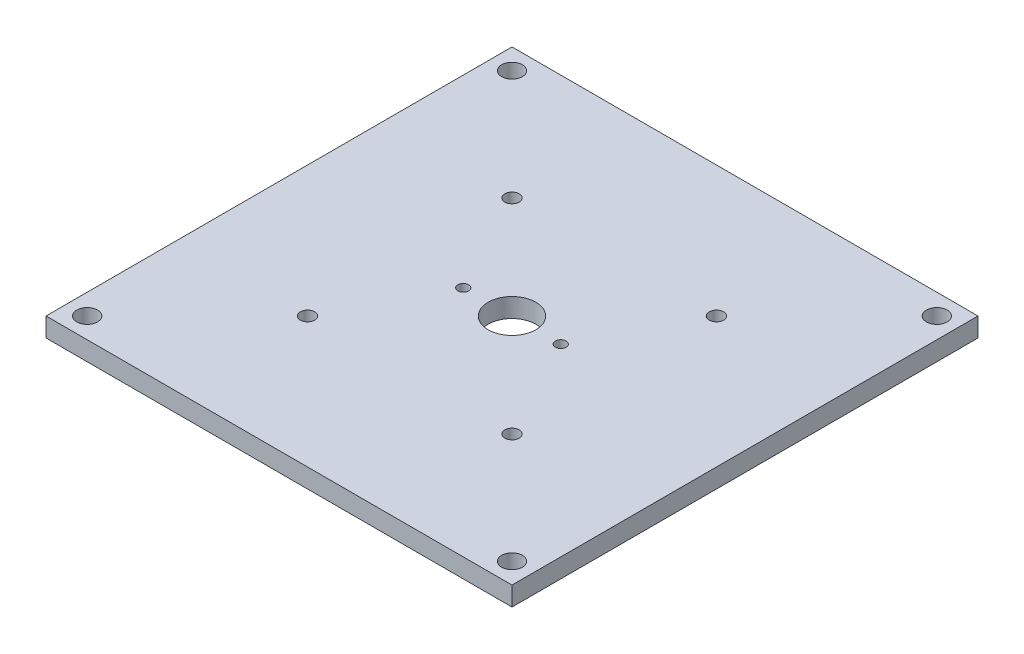
ISO-10303-21;
HEADER;
FILE_DESCRIPTION(('STEP AP214'),'2;1');
FILE_NAME('part.step','',(''),(''),'','','');
FILE_SCHEMA(('AUTOMOTIVE_DESIGN { 1 0 10303 214 1 1 1 1 }'));
ENDSEC;
DATA;
#1=APPLICATION_CONTEXT('core data for automotive mechanical design processes');
#2=APPLICATION_PROTOCOL_DEFINITION('international standard','automotive_design',2000,#1);
#3=PRODUCT_CONTEXT('',#1,'mechanical');
#4=PRODUCT('Part','Part','',(#3));
#5=PRODUCT_RELATED_PRODUCT_CATEGORY('part','',(#4));
#6=PRODUCT_DEFINITION_FORMATION('','',#4);
#7=PRODUCT_DEFINITION_CONTEXT('part definition',#1,'design');
#8=PRODUCT_DEFINITION('design','',#6,#7);
#9=PRODUCT_DEFINITION_SHAPE('','',#8);
#10=(LENGTH_UNIT() NAMED_UNIT(*) SI_UNIT(.MILLI.,.METRE.));
#11=(NAMED_UNIT(*) PLANE_ANGLE_UNIT() SI_UNIT($,.RADIAN.));
#12=(NAMED_UNIT(*) SI_UNIT($,.STERADIAN.) SOLID_ANGLE_UNIT());
#13=UNCERTAINTY_MEASURE_WITH_UNIT(LENGTH_MEASURE(1.E-05),#10,'distance_accuracy_value','');
#14=(GEOMETRIC_REPRESENTATION_CONTEXT(3) GLOBAL_UNCERTAINTY_ASSIGNED_CONTEXT((#13)) GLOBAL_UNIT_ASSIGNED_CONTEXT((#10,
#11,#12)) REPRESENTATION_CONTEXT('',''));
#15=CARTESIAN_POINT('',(0.,0.,0.));
#16=DIRECTION('',(0.,0.,1.));
#17=DIRECTION('',(1.,0.,0.));
#18=AXIS2_PLACEMENT_3D('',#15,#16,#17);
#19=CARTESIAN_POINT('',(-77.5,6.35,-77.5));
#20=DIRECTION('',(1.,0.,0.));
#21=DIRECTION('',(0.,0.,-1.));
#22=AXIS2_PLACEMENT_3D('',#19,#20,#21);
#23=PLANE('',#22);
#24=DIRECTION('',(0.,0.,1.));
#25=VECTOR('',#24,1.);
#26=CARTESIAN_POINT('',(-77.5,0.,-77.5));
#27=LINE('',#26,#25);
#28=CARTESIAN_POINT('',(-77.5,0.,-77.5));
#29=VERTEX_POINT('',#28);
#30=CARTESIAN_POINT('',(-77.5,0.,77.5));
#31=VERTEX_POINT('',#30);
#32=EDGE_CURVE('E97',#29,#31,#27,.T.);
#33=ORIENTED_EDGE('',*,*,#32,.T.);
#34=DIRECTION('',(0.,-1.,0.));
#35=VECTOR('',#34,1.);
#36=CARTESIAN_POINT('',(-77.5,6.35,77.5));
#37=LINE('',#36,#35);
#38=CARTESIAN_POINT('',(-77.5,6.35,77.5));
#39=VERTEX_POINT('',#38);
#40=EDGE_CURVE('E11',#39,#31,#37,.T.);
#41=ORIENTED_EDGE('',*,*,#40,.F.);
#42=DIRECTION('',(0.,0.,1.));
#43=VECTOR('',#42,1.);
#44=CARTESIAN_POINT('',(-77.5,6.35,-77.5));
#45=LINE('',#44,#43);
#46=CARTESIAN_POINT('',(-77.5,6.35,-77.5));
#47=VERTEX_POINT('',#46);
#48=EDGE_CURVE('E85',#47,#39,#45,.T.);
#49=ORIENTED_EDGE('',*,*,#48,.F.);
#50=DIRECTION('',(0.,-1.,0.));
#51=VECTOR('',#50,1.);
#52=CARTESIAN_POINT('',(-77.5,6.35,-77.5));
#53=LINE('',#52,#51);
#54=EDGE_CURVE('E93',#47,#29,#53,.T.);
#55=ORIENTED_EDGE('',*,*,#54,.T.);
#56=EDGE_LOOP('',(#33,#41,#49,#55));
#57=FACE_BOUND('',#56,.T.);
#58=ADVANCED_FACE('F34',(#57),#23,.F.);
#59=CARTESIAN_POINT('',(-77.5,6.35,77.5));
#60=DIRECTION('',(0.,0.,-1.));
#61=DIRECTION('',(-1.,0.,0.));
#62=AXIS2_PLACEMENT_3D('',#59,#60,#61);
#63=PLANE('',#62);
#64=DIRECTION('',(1.,0.,0.));
#65=VECTOR('',#64,1.);
#66=CARTESIAN_POINT('',(-77.5,0.,77.5));
#67=LINE('',#66,#65);
#68=CARTESIAN_POINT('',(77.5,0.,77.5));
#69=VERTEX_POINT('',#68);
#70=EDGE_CURVE('E89',#31,#69,#67,.T.);
#71=ORIENTED_EDGE('',*,*,#70,.T.);
#72=DIRECTION('',(0.,-1.,0.));
#73=VECTOR('',#72,1.);
#74=CARTESIAN_POINT('',(77.5,6.35,77.5));
#75=LINE('',#74,#73);
#76=CARTESIAN_POINT('',(77.5,6.35,77.5));
#77=VERTEX_POINT('',#76);
#78=EDGE_CURVE('E42',#77,#69,#75,.T.);
#79=ORIENTED_EDGE('',*,*,#78,.F.);
#80=DIRECTION('',(1.,0.,0.));
#81=VECTOR('',#80,1.);
#82=CARTESIAN_POINT('',(-77.5,6.35,77.5));
#83=LINE('',#82,#81);
#84=EDGE_CURVE('E80',#39,#77,#83,.T.);
#85=ORIENTED_EDGE('',*,*,#84,.F.);
#86=ORIENTED_EDGE('',*,*,#40,.T.);
#87=EDGE_LOOP('',(#71,#79,#85,#86));
#88=FACE_BOUND('',#87,.T.);
#89=ADVANCED_FACE('F88',(#88),#63,.F.);
#90=CARTESIAN_POINT('',(77.5,6.35,-77.5));
#91=DIRECTION('',(-1.,0.,0.));
#92=DIRECTION('',(0.,0.,1.));
#93=AXIS2_PLACEMENT_3D('',#90,#91,#92);
#94=PLANE('',#93);
#95=DIRECTION('',(0.,0.,-1.));
#96=VECTOR('',#95,1.);
#97=CARTESIAN_POINT('',(77.5,0.,-77.5));
#98=LINE('',#97,#96);
#99=CARTESIAN_POINT('',(77.5,0.,-77.5));
#100=VERTEX_POINT('',#99);
#101=EDGE_CURVE('E67',#69,#100,#98,.T.);
#102=ORIENTED_EDGE('',*,*,#101,.T.);
#103=DIRECTION('',(0.,-1.,0.));
#104=VECTOR('',#103,1.);
#105=CARTESIAN_POINT('',(77.5,6.35,-77.5));
#106=LINE('',#105,#104);
#107=CARTESIAN_POINT('',(77.5,6.35,-77.5));
#108=VERTEX_POINT('',#107);
#109=EDGE_CURVE('E90',#108,#100,#106,.T.);
#110=ORIENTED_EDGE('',*,*,#109,.F.);
#111=DIRECTION('',(0.,0.,-1.));
#112=VECTOR('',#111,1.);
#113=CARTESIAN_POINT('',(77.5,6.35,-77.5));
#114=LINE('',#113,#112);
#115=EDGE_CURVE('E83',#77,#108,#114,.T.);
#116=ORIENTED_EDGE('',*,*,#115,.F.);
#117=ORIENTED_EDGE('',*,*,#78,.T.);
#118=EDGE_LOOP('',(#102,#110,#116,#117));
#119=FACE_BOUND('',#118,.T.);
#120=ADVANCED_FACE('F91',(#119),#94,.F.);
#121=CARTESIAN_POINT('',(-77.5,6.35,-77.5));
#122=DIRECTION('',(0.,0.,1.));
#123=DIRECTION('',(1.,0.,0.));
#124=AXIS2_PLACEMENT_3D('',#121,#122,#123);
#125=PLANE('',#124);
#126=DIRECTION('',(-1.,0.,0.));
#127=VECTOR('',#126,1.);
#128=CARTESIAN_POINT('',(-77.5,0.,-77.5));
#129=LINE('',#128,#127);
#130=EDGE_CURVE('E73',#100,#29,#129,.T.);
#131=ORIENTED_EDGE('',*,*,#130,.T.);
#132=ORIENTED_EDGE('',*,*,#54,.F.);
#133=DIRECTION('',(-1.,0.,0.));
#134=VECTOR('',#133,1.);
#135=CARTESIAN_POINT('',(-77.5,6.35,-77.5));
#136=LINE('',#135,#134);
#137=EDGE_CURVE('E50',#108,#47,#136,.T.);
#138=ORIENTED_EDGE('',*,*,#137,.F.);
#139=ORIENTED_EDGE('',*,*,#109,.T.);
#140=EDGE_LOOP('',(#131,#132,#138,#139));
#141=FACE_BOUND('',#140,.T.);
#142=ADVANCED_FACE('F105',(#141),#125,.F.);
#143=CARTESIAN_POINT('',(0.,6.35,0.));
#144=DIRECTION('',(0.,1.,0.));
#145=DIRECTION('',(0.,0.,1.));
#146=AXIS2_PLACEMENT_3D('',#143,#144,#145);
#147=PLANE('',#146);
#148=CARTESIAN_POINT('',(16.215,6.35,0.));
#149=DIRECTION('',(0.,1.,0.));
#150=DIRECTION('',(0.,0.,1.));
#151=AXIS2_PLACEMENT_3D('',#148,#149,#150);
#152=CIRCLE('',#151,1.8);
#153=CARTESIAN_POINT('',(16.215,6.35,1.79999999999999));
#154=VERTEX_POINT('',#153);
#155=EDGE_CURVE('E173',#154,#154,#152,.T.);
#156=ORIENTED_EDGE('',*,*,#155,.F.);
#157=EDGE_LOOP('',(#156));
#158=FACE_BOUND('',#157,.T.);
#159=CARTESIAN_POINT('',(-16.215,6.35,0.));
#160=DIRECTION('',(0.,1.,0.));
#161=DIRECTION('',(0.,0.,1.));
#162=AXIS2_PLACEMENT_3D('',#159,#160,#161);
#163=CIRCLE('',#162,1.8);
#164=CARTESIAN_POINT('',(-16.215,6.35,1.8));
#165=VERTEX_POINT('',#164);
#166=EDGE_CURVE('E167',#165,#165,#163,.T.);
#167=ORIENTED_EDGE('',*,*,#166,.F.);
#168=EDGE_LOOP('',(#167));
#169=FACE_BOUND('',#168,.T.);
#170=CARTESIAN_POINT('',(-34.,6.35,-34.));
#171=DIRECTION('',(0.,1.,0.));
#172=DIRECTION('',(0.,0.,1.));
#173=AXIS2_PLACEMENT_3D('',#170,#171,#172);
#174=CIRCLE('',#173,2.4);
#175=CARTESIAN_POINT('',(-34.,6.35,-31.6));
#176=VERTEX_POINT('',#175);
#177=EDGE_CURVE('E161',#176,#176,#174,.T.);
#178=ORIENTED_EDGE('',*,*,#177,.F.);
#179=EDGE_LOOP('',(#178));
#180=FACE_BOUND('',#179,.T.);
#181=CARTESIAN_POINT('',(34.,6.35,-34.));
#182=DIRECTION('',(0.,1.,0.));
#183=DIRECTION('',(0.,0.,1.));
#184=AXIS2_PLACEMENT_3D('',#181,#182,#183);
#185=CIRCLE('',#184,2.4);
#186=CARTESIAN_POINT('',(34.,6.35,-31.6));
#187=VERTEX_POINT('',#186);
#188=EDGE_CURVE('E155',#187,#187,#185,.T.);
#189=ORIENTED_EDGE('',*,*,#188,.F.);
#190=EDGE_LOOP('',(#189));
#191=FACE_BOUND('',#190,.T.);
#192=CARTESIAN_POINT('',(34.,6.35,34.));
#193=DIRECTION('',(0.,1.,0.));
#194=DIRECTION('',(0.,0.,1.));
#195=AXIS2_PLACEMENT_3D('',#192,#193,#194);
#196=CIRCLE('',#195,2.4);
#197=CARTESIAN_POINT('',(34.,6.35,36.4));
#198=VERTEX_POINT('',#197);
#199=EDGE_CURVE('E149',#198,#198,#196,.T.);
#200=ORIENTED_EDGE('',*,*,#199,.F.);
#201=EDGE_LOOP('',(#200));
#202=FACE_BOUND('',#201,.T.);
#203=CARTESIAN_POINT('',(-34.,6.35,34.));
#204=DIRECTION('',(0.,1.,0.));
#205=DIRECTION('',(0.,0.,1.));
#206=AXIS2_PLACEMENT_3D('',#203,#204,#205);
#207=CIRCLE('',#206,2.4);
#208=CARTESIAN_POINT('',(-34.,6.35,36.4));
#209=VERTEX_POINT('',#208);
#210=EDGE_CURVE('E143',#209,#209,#207,.T.);
#211=ORIENTED_EDGE('',*,*,#210,.F.);
#212=EDGE_LOOP('',(#211));
#213=FACE_BOUND('',#212,.T.);
#214=CARTESIAN_POINT('',(0.,6.35,0.));
#215=DIRECTION('',(0.,1.,0.));
#216=DIRECTION('',(0.,0.,1.));
#217=AXIS2_PLACEMENT_3D('',#214,#215,#216);
#218=CIRCLE('',#217,7.9375);
#219=CARTESIAN_POINT('',(0.,6.35,7.9375));
#220=VERTEX_POINT('',#219);
#221=EDGE_CURVE('E137',#220,#220,#218,.T.);
#222=ORIENTED_EDGE('',*,*,#221,.F.);
#223=EDGE_LOOP('',(#222));
#224=FACE_BOUND('',#223,.T.);
#225=CARTESIAN_POINT('',(-70.65,6.35,-70.65));
#226=DIRECTION('',(0.,1.,0.));
#227=DIRECTION('',(0.,0.,1.));
#228=AXIS2_PLACEMENT_3D('',#225,#226,#227);
#229=CIRCLE('',#228,3.4417);
#230=CARTESIAN_POINT('',(-70.65,6.35,-67.2083));
#231=VERTEX_POINT('',#230);
#232=EDGE_CURVE('E120',#231,#231,#229,.T.);
#233=ORIENTED_EDGE('',*,*,#232,.F.);
#234=EDGE_LOOP('',(#233));
#235=FACE_BOUND('',#234,.T.);
#236=CARTESIAN_POINT('',(70.65,6.35,70.65));
#237=DIRECTION('',(0.,1.,0.));
#238=DIRECTION('',(0.,0.,1.));
#239=AXIS2_PLACEMENT_3D('',#236,#237,#238);
#240=CIRCLE('',#239,3.4417);
#241=CARTESIAN_POINT('',(70.65,6.35,74.0917));
#242=VERTEX_POINT('',#241);
#243=EDGE_CURVE('E121',#242,#242,#240,.T.);
#244=ORIENTED_EDGE('',*,*,#243,.F.);
#245=EDGE_LOOP('',(#244));
#246=FACE_BOUND('',#245,.T.);
#247=CARTESIAN_POINT('',(-70.65,6.35,70.65));
#248=DIRECTION('',(0.,1.,0.));
#249=DIRECTION('',(0.,0.,1.));
#250=AXIS2_PLACEMENT_3D('',#247,#248,#249);
#251=CIRCLE('',#250,3.4417);
#252=CARTESIAN_POINT('',(-70.65,6.35,74.0917));
#253=VERTEX_POINT('',#252);
#254=EDGE_CURVE('E131',#253,#253,#251,.T.);
#255=ORIENTED_EDGE('',*,*,#254,.F.);
#256=EDGE_LOOP('',(#255));
#257=FACE_BOUND('',#256,.T.);
#258=CARTESIAN_POINT('',(70.65,6.35,-70.65));
#259=DIRECTION('',(0.,1.,0.));
#260=DIRECTION('',(0.,0.,1.));
#261=AXIS2_PLACEMENT_3D('',#258,#259,#260);
#262=CIRCLE('',#261,3.4417);
#263=CARTESIAN_POINT('',(70.65,6.35,-67.2083));
#264=VERTEX_POINT('',#263);
#265=EDGE_CURVE('E113',#264,#264,#262,.T.);
#266=ORIENTED_EDGE('',*,*,#265,.F.);
#267=EDGE_LOOP('',(#266));
#268=FACE_BOUND('',#267,.T.);
#269=ORIENTED_EDGE('',*,*,#48,.T.);
#270=ORIENTED_EDGE('',*,*,#84,.T.);
#271=ORIENTED_EDGE('',*,*,#115,.T.);
#272=ORIENTED_EDGE('',*,*,#137,.T.);
#273=EDGE_LOOP('',(#269,#270,#271,#272));
#274=FACE_BOUND('',#273,.T.);
#275=ADVANCED_FACE('F81',(#158,#169,#180,#191,#202,#213,#224,#235,#246,#257,#268,#274),#147,.T.);
#276=CARTESIAN_POINT('',(0.,0.,0.));
#277=DIRECTION('',(0.,1.,0.));
#278=DIRECTION('',(0.,0.,1.));
#279=AXIS2_PLACEMENT_3D('',#276,#277,#278);
#280=PLANE('',#279);
#281=CARTESIAN_POINT('',(16.215,0.,0.));
#282=DIRECTION('',(0.,1.,0.));
#283=DIRECTION('',(0.,0.,1.));
#284=AXIS2_PLACEMENT_3D('',#281,#282,#283);
#285=CIRCLE('',#284,1.8);
#286=CARTESIAN_POINT('',(16.215,0.,1.79999999999999));
#287=VERTEX_POINT('',#286);
#288=EDGE_CURVE('E170',#287,#287,#285,.T.);
#289=ORIENTED_EDGE('',*,*,#288,.T.);
#290=EDGE_LOOP('',(#289));
#291=FACE_BOUND('',#290,.T.);
#292=CARTESIAN_POINT('',(-16.215,0.,0.));
#293=DIRECTION('',(0.,1.,0.));
#294=DIRECTION('',(0.,0.,1.));
#295=AXIS2_PLACEMENT_3D('',#292,#293,#294);
#296=CIRCLE('',#295,1.8);
#297=CARTESIAN_POINT('',(-16.215,0.,1.8));
#298=VERTEX_POINT('',#297);
#299=EDGE_CURVE('E164',#298,#298,#296,.T.);
#300=ORIENTED_EDGE('',*,*,#299,.T.);
#301=EDGE_LOOP('',(#300));
#302=FACE_BOUND('',#301,.T.);
#303=CARTESIAN_POINT('',(-34.,0.,-34.));
#304=DIRECTION('',(0.,1.,0.));
#305=DIRECTION('',(0.,0.,1.));
#306=AXIS2_PLACEMENT_3D('',#303,#304,#305);
#307=CIRCLE('',#306,2.4);
#308=CARTESIAN_POINT('',(-34.,0.,-31.6));
#309=VERTEX_POINT('',#308);
#310=EDGE_CURVE('E158',#309,#309,#307,.T.);
#311=ORIENTED_EDGE('',*,*,#310,.T.);
#312=EDGE_LOOP('',(#311));
#313=FACE_BOUND('',#312,.T.);
#314=CARTESIAN_POINT('',(34.,0.,-34.));
#315=DIRECTION('',(0.,1.,0.));
#316=DIRECTION('',(0.,0.,1.));
#317=AXIS2_PLACEMENT_3D('',#314,#315,#316);
#318=CIRCLE('',#317,2.4);
#319=CARTESIAN_POINT('',(34.,0.,-31.6));
#320=VERTEX_POINT('',#319);
#321=EDGE_CURVE('E152',#320,#320,#318,.T.);
#322=ORIENTED_EDGE('',*,*,#321,.T.);
#323=EDGE_LOOP('',(#322));
#324=FACE_BOUND('',#323,.T.);
#325=CARTESIAN_POINT('',(34.,0.,34.));
#326=DIRECTION('',(0.,1.,0.));
#327=DIRECTION('',(0.,0.,1.));
#328=AXIS2_PLACEMENT_3D('',#325,#326,#327);
#329=CIRCLE('',#328,2.4);
#330=CARTESIAN_POINT('',(34.,0.,36.4));
#331=VERTEX_POINT('',#330);
#332=EDGE_CURVE('E146',#331,#331,#329,.T.);
#333=ORIENTED_EDGE('',*,*,#332,.T.);
#334=EDGE_LOOP('',(#333));
#335=FACE_BOUND('',#334,.T.);
#336=CARTESIAN_POINT('',(-34.,0.,34.));
#337=DIRECTION('',(0.,1.,0.));
#338=DIRECTION('',(0.,0.,1.));
#339=AXIS2_PLACEMENT_3D('',#336,#337,#338);
#340=CIRCLE('',#339,2.4);
#341=CARTESIAN_POINT('',(-34.,0.,36.4));
#342=VERTEX_POINT('',#341);
#343=EDGE_CURVE('E140',#342,#342,#340,.T.);
#344=ORIENTED_EDGE('',*,*,#343,.T.);
#345=EDGE_LOOP('',(#344));
#346=FACE_BOUND('',#345,.T.);
#347=CARTESIAN_POINT('',(0.,0.,0.));
#348=DIRECTION('',(0.,1.,0.));
#349=DIRECTION('',(0.,0.,1.));
#350=AXIS2_PLACEMENT_3D('',#347,#348,#349);
#351=CIRCLE('',#350,7.9375);
#352=CARTESIAN_POINT('',(0.,0.,7.9375));
#353=VERTEX_POINT('',#352);
#354=EDGE_CURVE('E134',#353,#353,#351,.F.);
#355=ORIENTED_EDGE('',*,*,#354,.F.);
#356=EDGE_LOOP('',(#355));
#357=FACE_BOUND('',#356,.T.);
#358=CARTESIAN_POINT('',(-70.65,0.,-70.65));
#359=DIRECTION('',(0.,1.,0.));
#360=DIRECTION('',(0.,0.,1.));
#361=AXIS2_PLACEMENT_3D('',#358,#359,#360);
#362=CIRCLE('',#361,3.4417);
#363=CARTESIAN_POINT('',(-70.65,0.,-67.2083));
#364=VERTEX_POINT('',#363);
#365=EDGE_CURVE('E116',#364,#364,#362,.F.);
#366=ORIENTED_EDGE('',*,*,#365,.F.);
#367=EDGE_LOOP('',(#366));
#368=FACE_BOUND('',#367,.T.);
#369=CARTESIAN_POINT('',(70.65,0.,70.65));
#370=DIRECTION('',(0.,1.,0.));
#371=DIRECTION('',(0.,0.,1.));
#372=AXIS2_PLACEMENT_3D('',#369,#370,#371);
#373=CIRCLE('',#372,3.4417);
#374=CARTESIAN_POINT('',(70.65,0.,74.0917));
#375=VERTEX_POINT('',#374);
#376=EDGE_CURVE('E117',#375,#375,#373,.F.);
#377=ORIENTED_EDGE('',*,*,#376,.F.);
#378=EDGE_LOOP('',(#377));
#379=FACE_BOUND('',#378,.T.);
#380=CARTESIAN_POINT('',(-70.65,0.,70.65));
#381=DIRECTION('',(0.,1.,0.));
#382=DIRECTION('',(0.,0.,1.));
#383=AXIS2_PLACEMENT_3D('',#380,#381,#382);
#384=CIRCLE('',#383,3.4417);
#385=CARTESIAN_POINT('',(-70.65,0.,74.0917));
#386=VERTEX_POINT('',#385);
#387=EDGE_CURVE('E124',#386,#386,#384,.F.);
#388=ORIENTED_EDGE('',*,*,#387,.F.);
#389=EDGE_LOOP('',(#388));
#390=FACE_BOUND('',#389,.T.);
#391=CARTESIAN_POINT('',(70.65,0.,-70.65));
#392=DIRECTION('',(0.,1.,0.));
#393=DIRECTION('',(0.,0.,1.));
#394=AXIS2_PLACEMENT_3D('',#391,#392,#393);
#395=CIRCLE('',#394,3.4417);
#396=CARTESIAN_POINT('',(70.65,0.,-67.2083));
#397=VERTEX_POINT('',#396);
#398=EDGE_CURVE('E100',#397,#397,#395,.F.);
#399=ORIENTED_EDGE('',*,*,#398,.F.);
#400=EDGE_LOOP('',(#399));
#401=FACE_BOUND('',#400,.T.);
#402=ORIENTED_EDGE('',*,*,#32,.F.);
#403=ORIENTED_EDGE('',*,*,#130,.F.);
#404=ORIENTED_EDGE('',*,*,#101,.F.);
#405=ORIENTED_EDGE('',*,*,#70,.F.);
#406=EDGE_LOOP('',(#402,#403,#404,#405));
#407=FACE_BOUND('',#406,.T.);
#408=ADVANCED_FACE('F108',(#291,#302,#313,#324,#335,#346,#357,#368,#379,#390,#401,#407),#280,.F.);
#409=CARTESIAN_POINT('',(70.65,-9.73459763523898,-70.65));
#410=DIRECTION('',(0.,1.,0.));
#411=DIRECTION('',(0.,0.,1.));
#412=AXIS2_PLACEMENT_3D('',#409,#410,#411);
#413=CYLINDRICAL_SURFACE('',#412,3.4417);
#414=ORIENTED_EDGE('',*,*,#398,.T.);
#415=EDGE_LOOP('',(#414));
#416=FACE_BOUND('',#415,.T.);
#417=ORIENTED_EDGE('',*,*,#265,.T.);
#418=EDGE_LOOP('',(#417));
#419=FACE_BOUND('',#418,.T.);
#420=ADVANCED_FACE('F202',(#416,#419),#413,.F.);
#421=CARTESIAN_POINT('',(-70.65,-9.73459763523898,70.65));
#422=DIRECTION('',(0.,1.,0.));
#423=DIRECTION('',(0.,0.,1.));
#424=AXIS2_PLACEMENT_3D('',#421,#422,#423);
#425=CYLINDRICAL_SURFACE('',#424,3.4417);
#426=ORIENTED_EDGE('',*,*,#387,.T.);
#427=EDGE_LOOP('',(#426));
#428=FACE_BOUND('',#427,.T.);
#429=ORIENTED_EDGE('',*,*,#254,.T.);
#430=EDGE_LOOP('',(#429));
#431=FACE_BOUND('',#430,.T.);
#432=ADVANCED_FACE('F204',(#428,#431),#425,.F.);
#433=CARTESIAN_POINT('',(70.65,-9.73459763523898,70.65));
#434=DIRECTION('',(0.,1.,0.));
#435=DIRECTION('',(0.,0.,1.));
#436=AXIS2_PLACEMENT_3D('',#433,#434,#435);
#437=CYLINDRICAL_SURFACE('',#436,3.4417);
#438=ORIENTED_EDGE('',*,*,#376,.T.);
#439=EDGE_LOOP('',(#438));
#440=FACE_BOUND('',#439,.T.);
#441=ORIENTED_EDGE('',*,*,#243,.T.);
#442=EDGE_LOOP('',(#441));
#443=FACE_BOUND('',#442,.T.);
#444=ADVANCED_FACE('F211',(#440,#443),#437,.F.);
#445=CARTESIAN_POINT('',(-70.65,-9.73459763523898,-70.65));
#446=DIRECTION('',(0.,1.,0.));
#447=DIRECTION('',(0.,0.,1.));
#448=AXIS2_PLACEMENT_3D('',#445,#446,#447);
#449=CYLINDRICAL_SURFACE('',#448,3.4417);
#450=ORIENTED_EDGE('',*,*,#365,.T.);
#451=EDGE_LOOP('',(#450));
#452=FACE_BOUND('',#451,.T.);
#453=ORIENTED_EDGE('',*,*,#232,.T.);
#454=EDGE_LOOP('',(#453));
#455=FACE_BOUND('',#454,.T.);
#456=ADVANCED_FACE('F285',(#452,#455),#449,.F.);
#457=CARTESIAN_POINT('',(0.,-22.4506403026729,0.));
#458=DIRECTION('',(0.,1.,0.));
#459=DIRECTION('',(0.,0.,1.));
#460=AXIS2_PLACEMENT_3D('',#457,#458,#459);
#461=CYLINDRICAL_SURFACE('',#460,7.9375);
#462=ORIENTED_EDGE('',*,*,#354,.T.);
#463=EDGE_LOOP('',(#462));
#464=FACE_BOUND('',#463,.T.);
#465=ORIENTED_EDGE('',*,*,#221,.T.);
#466=EDGE_LOOP('',(#465));
#467=FACE_BOUND('',#466,.T.);
#468=ADVANCED_FACE('F282',(#464,#467),#461,.F.);
#469=CARTESIAN_POINT('',(-34.,6.35,34.));
#470=DIRECTION('',(0.,1.,0.));
#471=DIRECTION('',(0.,0.,1.));
#472=AXIS2_PLACEMENT_3D('',#469,#470,#471);
#473=CYLINDRICAL_SURFACE('',#472,2.4);
#474=ORIENTED_EDGE('',*,*,#343,.F.);
#475=EDGE_LOOP('',(#474));
#476=FACE_BOUND('',#475,.T.);
#477=ORIENTED_EDGE('',*,*,#210,.T.);
#478=EDGE_LOOP('',(#477));
#479=FACE_BOUND('',#478,.T.);
#480=ADVANCED_FACE('F278',(#476,#479),#473,.F.);
#481=CARTESIAN_POINT('',(34.,6.35,34.));
#482=DIRECTION('',(0.,1.,0.));
#483=DIRECTION('',(0.,0.,1.));
#484=AXIS2_PLACEMENT_3D('',#481,#482,#483);
#485=CYLINDRICAL_SURFACE('',#484,2.4);
#486=ORIENTED_EDGE('',*,*,#332,.F.);
#487=EDGE_LOOP('',(#486));
#488=FACE_BOUND('',#487,.T.);
#489=ORIENTED_EDGE('',*,*,#199,.T.);
#490=EDGE_LOOP('',(#489));
#491=FACE_BOUND('',#490,.T.);
#492=ADVANCED_FACE('F274',(#488,#491),#485,.F.);
#493=CARTESIAN_POINT('',(34.,6.35,-34.));
#494=DIRECTION('',(0.,1.,0.));
#495=DIRECTION('',(0.,0.,1.));
#496=AXIS2_PLACEMENT_3D('',#493,#494,#495);
#497=CYLINDRICAL_SURFACE('',#496,2.4);
#498=ORIENTED_EDGE('',*,*,#321,.F.);
#499=EDGE_LOOP('',(#498));
#500=FACE_BOUND('',#499,.T.);
#501=ORIENTED_EDGE('',*,*,#188,.T.);
#502=EDGE_LOOP('',(#501));
#503=FACE_BOUND('',#502,.T.);
#504=ADVANCED_FACE('F270',(#500,#503),#497,.F.);
#505=CARTESIAN_POINT('',(-34.,6.35,-34.));
#506=DIRECTION('',(0.,1.,0.));
#507=DIRECTION('',(0.,0.,1.));
#508=AXIS2_PLACEMENT_3D('',#505,#506,#507);
#509=CYLINDRICAL_SURFACE('',#508,2.4);
#510=ORIENTED_EDGE('',*,*,#310,.F.);
#511=EDGE_LOOP('',(#510));
#512=FACE_BOUND('',#511,.T.);
#513=ORIENTED_EDGE('',*,*,#177,.T.);
#514=EDGE_LOOP('',(#513));
#515=FACE_BOUND('',#514,.T.);
#516=ADVANCED_FACE('F251',(#512,#515),#509,.F.);
#517=CARTESIAN_POINT('',(-16.215,6.35,0.));
#518=DIRECTION('',(0.,1.,0.));
#519=DIRECTION('',(0.,0.,1.));
#520=AXIS2_PLACEMENT_3D('',#517,#518,#519);
#521=CYLINDRICAL_SURFACE('',#520,1.8);
#522=ORIENTED_EDGE('',*,*,#299,.F.);
#523=EDGE_LOOP('',(#522));
#524=FACE_BOUND('',#523,.T.);
#525=ORIENTED_EDGE('',*,*,#166,.T.);
#526=EDGE_LOOP('',(#525));
#527=FACE_BOUND('',#526,.T.);
#528=ADVANCED_FACE('F246',(#524,#527),#521,.F.);
#529=CARTESIAN_POINT('',(16.215,6.35,0.));
#530=DIRECTION('',(0.,1.,0.));
#531=DIRECTION('',(0.,0.,1.));
#532=AXIS2_PLACEMENT_3D('',#529,#530,#531);
#533=CYLINDRICAL_SURFACE('',#532,1.8);
#534=ORIENTED_EDGE('',*,*,#288,.F.);
#535=EDGE_LOOP('',(#534));
#536=FACE_BOUND('',#535,.T.);
#537=ORIENTED_EDGE('',*,*,#155,.T.);
#538=EDGE_LOOP('',(#537));
#539=FACE_BOUND('',#538,.T.);
#540=ADVANCED_FACE('F177',(#536,#539),#533,.F.);
#541=CLOSED_SHELL('',(#58,#89,#120,#142,#275,#408,#420,#432,#444,#456,#468,#480,#492,#504,#516,
#528,#540));
#542=MANIFOLD_SOLID_BREP('B2',#541);
#543=ADVANCED_BREP_SHAPE_REPRESENTATION('',(#18,#542),#14);
#544=SHAPE_DEFINITION_REPRESENTATION(#9,#543);
ENDSEC;
END-ISO-10303-21;
